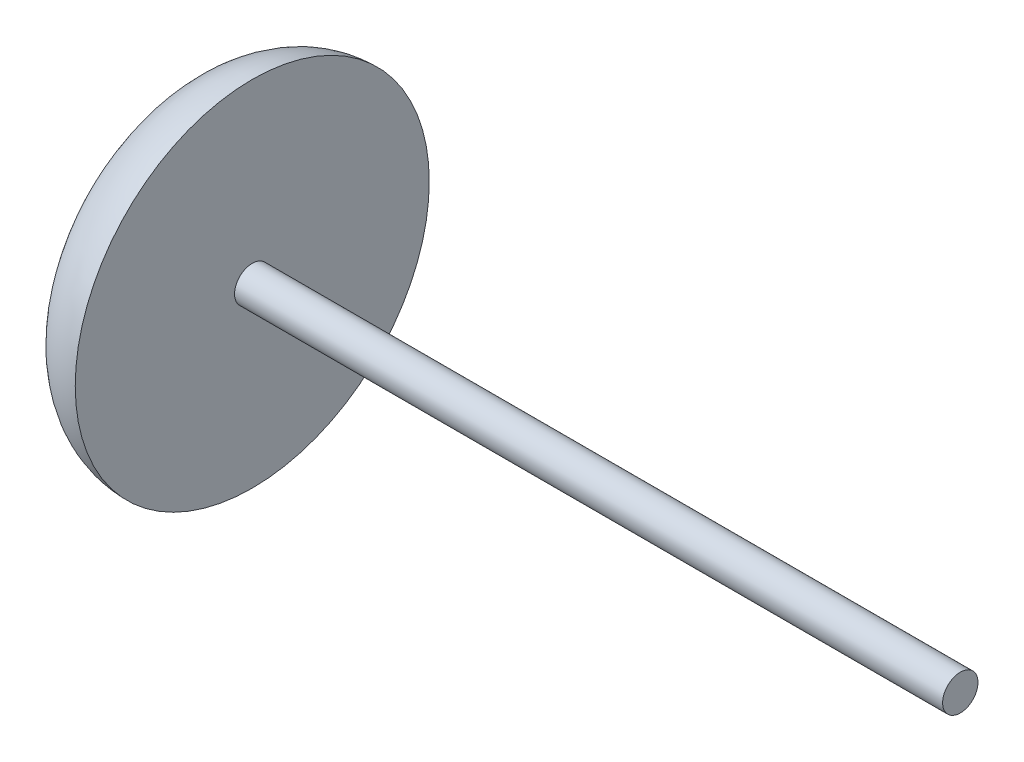
ISO-10303-21;
HEADER;
FILE_DESCRIPTION(('STEP AP214'),'2;1');
FILE_NAME('part.step','',(''),(''),'','','');
FILE_SCHEMA(('AUTOMOTIVE_DESIGN { 1 0 10303 214 1 1 1 1 }'));
ENDSEC;
DATA;
#1=APPLICATION_CONTEXT('core data for automotive mechanical design processes');
#2=APPLICATION_PROTOCOL_DEFINITION('international standard','automotive_design',2000,#1);
#3=PRODUCT_CONTEXT('',#1,'mechanical');
#4=PRODUCT('Part','Part','',(#3));
#5=PRODUCT_RELATED_PRODUCT_CATEGORY('part','',(#4));
#6=PRODUCT_DEFINITION_FORMATION('','',#4);
#7=PRODUCT_DEFINITION_CONTEXT('part definition',#1,'design');
#8=PRODUCT_DEFINITION('design','',#6,#7);
#9=PRODUCT_DEFINITION_SHAPE('','',#8);
#10=(LENGTH_UNIT() NAMED_UNIT(*) SI_UNIT(.MILLI.,.METRE.));
#11=(NAMED_UNIT(*) PLANE_ANGLE_UNIT() SI_UNIT($,.RADIAN.));
#12=(NAMED_UNIT(*) SI_UNIT($,.STERADIAN.) SOLID_ANGLE_UNIT());
#13=UNCERTAINTY_MEASURE_WITH_UNIT(LENGTH_MEASURE(1.E-05),#10,'distance_accuracy_value','');
#14=(GEOMETRIC_REPRESENTATION_CONTEXT(3) GLOBAL_UNCERTAINTY_ASSIGNED_CONTEXT((#13)) GLOBAL_UNIT_ASSIGNED_CONTEXT((#10,
#11,#12)) REPRESENTATION_CONTEXT('',''));
#15=CARTESIAN_POINT('',(0.,0.,0.));
#16=DIRECTION('',(0.,0.,1.));
#17=DIRECTION('',(1.,0.,0.));
#18=AXIS2_PLACEMENT_3D('',#15,#16,#17);
#19=CARTESIAN_POINT('',(0.,0.,0.));
#20=DIRECTION('',(1.,0.,0.));
#21=DIRECTION('',(0.,0.,-1.));
#22=AXIS2_PLACEMENT_3D('',#19,#20,#21);
#23=PLANE('',#22);
#24=CARTESIAN_POINT('',(0.,0.,0.));
#25=DIRECTION('',(1.,0.,0.));
#26=DIRECTION('',(0.,0.,-1.));
#27=AXIS2_PLACEMENT_3D('',#24,#25,#26);
#28=CIRCLE('',#27,15.);
#29=CARTESIAN_POINT('',(0.,0.,-15.));
#30=VERTEX_POINT('',#29);
#31=EDGE_CURVE('E10',#30,#30,#28,.F.);
#32=ORIENTED_EDGE('',*,*,#31,.T.);
#33=EDGE_LOOP('',(#32));
#34=FACE_BOUND('',#33,.T.);
#35=ADVANCED_FACE('F33',(#34),#23,.F.);
#36=CARTESIAN_POINT('',(9.99999999999999,0.,0.));
#37=DIRECTION('',(1.,0.,0.));
#38=DIRECTION('',(0.,0.,-1.));
#39=AXIS2_PLACEMENT_3D('',#36,#37,#38);
#40=PLANE('',#39);
#41=CARTESIAN_POINT('',(9.99999999999999,0.,0.));
#42=DIRECTION('',(1.,0.,0.));
#43=DIRECTION('',(0.,0.,-1.));
#44=AXIS2_PLACEMENT_3D('',#41,#42,#43);
#45=CIRCLE('',#44,2.5);
#46=CARTESIAN_POINT('',(9.99999999999999,0.,-2.5));
#47=VERTEX_POINT('',#46);
#48=EDGE_CURVE('E44',#47,#47,#45,.T.);
#49=ORIENTED_EDGE('',*,*,#48,.F.);
#50=EDGE_LOOP('',(#49));
#51=FACE_BOUND('',#50,.T.);
#52=CARTESIAN_POINT('',(9.99999999999999,0.,0.));
#53=DIRECTION('',(1.,0.,0.));
#54=DIRECTION('',(0.,0.,-1.));
#55=AXIS2_PLACEMENT_3D('',#52,#53,#54);
#56=CIRCLE('',#55,25.);
#57=CARTESIAN_POINT('',(9.99999999999999,0.,-25.));
#58=VERTEX_POINT('',#57);
#59=EDGE_CURVE('E40',#58,#58,#56,.T.);
#60=ORIENTED_EDGE('',*,*,#59,.T.);
#61=EDGE_LOOP('',(#60));
#62=FACE_BOUND('',#61,.T.);
#63=ADVANCED_FACE('F58',(#51,#62),#40,.T.);
#64=CARTESIAN_POINT('',(9.99999999999999,0.,0.));
#65=DIRECTION('',(1.,0.,0.));
#66=DIRECTION('',(0.,0.,-1.));
#67=AXIS2_PLACEMENT_3D('',#64,#65,#66);
#68=CYLINDRICAL_SURFACE('',#67,2.5);
#69=ORIENTED_EDGE('',*,*,#48,.T.);
#70=EDGE_LOOP('',(#69));
#71=FACE_BOUND('',#70,.T.);
#72=CARTESIAN_POINT('',(110.,0.,0.));
#73=DIRECTION('',(1.,0.,0.));
#74=DIRECTION('',(0.,0.,-1.));
#75=AXIS2_PLACEMENT_3D('',#72,#73,#74);
#76=CIRCLE('',#75,2.5);
#77=CARTESIAN_POINT('',(110.,0.,-2.5));
#78=VERTEX_POINT('',#77);
#79=EDGE_CURVE('E48',#78,#78,#76,.T.);
#80=ORIENTED_EDGE('',*,*,#79,.F.);
#81=EDGE_LOOP('',(#80));
#82=FACE_BOUND('',#81,.T.);
#83=ADVANCED_FACE('F56',(#71,#82),#68,.T.);
#84=CARTESIAN_POINT('',(110.,0.,0.));
#85=DIRECTION('',(1.,0.,0.));
#86=DIRECTION('',(0.,0.,-1.));
#87=AXIS2_PLACEMENT_3D('',#84,#85,#86);
#88=PLANE('',#87);
#89=ORIENTED_EDGE('',*,*,#79,.T.);
#90=EDGE_LOOP('',(#89));
#91=FACE_BOUND('',#90,.T.);
#92=ADVANCED_FACE('F54',(#91),#88,.T.);
#93=CARTESIAN_POINT('',(9.99999999999999,0.,0.));
#94=DIRECTION('',(1.,0.,0.));
#95=DIRECTION('',(0.,0.,-1.));
#96=AXIS2_PLACEMENT_3D('',#93,#94,#95);
#97=TOROIDAL_SURFACE('',#96,15.,10.);
#98=ORIENTED_EDGE('',*,*,#31,.F.);
#99=EDGE_LOOP('',(#98));
#100=FACE_BOUND('',#99,.T.);
#101=ORIENTED_EDGE('',*,*,#59,.F.);
#102=EDGE_LOOP('',(#101));
#103=FACE_BOUND('',#102,.T.);
#104=ADVANCED_FACE('F35',(#100,#103),#97,.T.);
#105=CLOSED_SHELL('',(#35,#63,#83,#92,#104));
#106=MANIFOLD_SOLID_BREP('B2',#105);
#107=ADVANCED_BREP_SHAPE_REPRESENTATION('',(#18,#106),#14);
#108=SHAPE_DEFINITION_REPRESENTATION(#9,#107);
ENDSEC;
END-ISO-10303-21;
